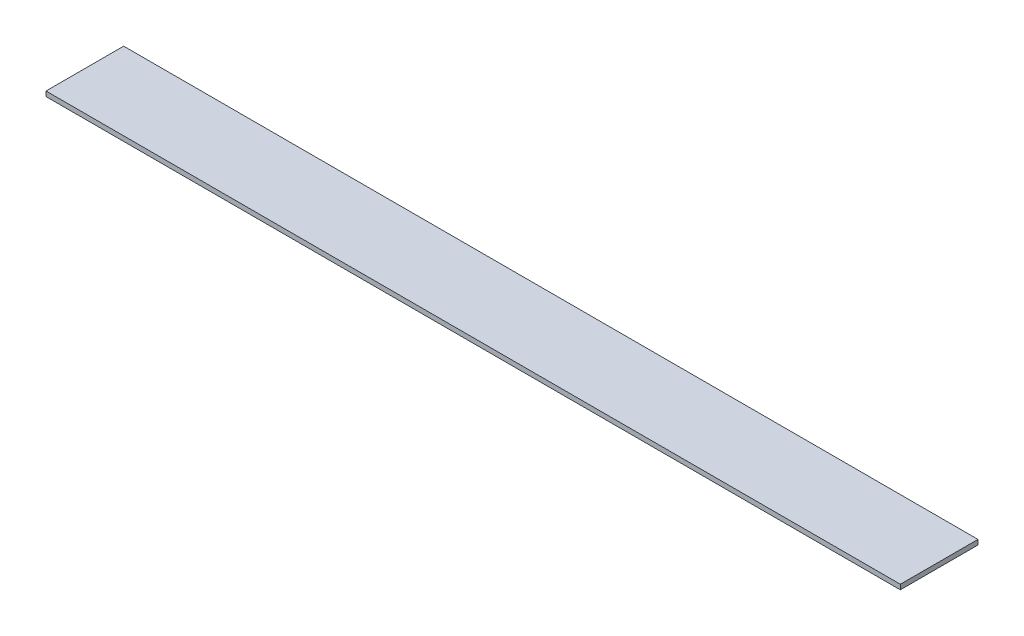
ISO-10303-21;
HEADER;
FILE_DESCRIPTION(('STEP AP214'),'2;1');
FILE_NAME('part.step','',(''),(''),'','','');
FILE_SCHEMA(('AUTOMOTIVE_DESIGN { 1 0 10303 214 1 1 1 1 }'));
ENDSEC;
DATA;
#1=APPLICATION_CONTEXT('core data for automotive mechanical design processes');
#2=APPLICATION_PROTOCOL_DEFINITION('international standard','automotive_design',2000,#1);
#3=PRODUCT_CONTEXT('',#1,'mechanical');
#4=PRODUCT('Part','Part','',(#3));
#5=PRODUCT_RELATED_PRODUCT_CATEGORY('part','',(#4));
#6=PRODUCT_DEFINITION_FORMATION('','',#4);
#7=PRODUCT_DEFINITION_CONTEXT('part definition',#1,'design');
#8=PRODUCT_DEFINITION('design','',#6,#7);
#9=PRODUCT_DEFINITION_SHAPE('','',#8);
#10=(LENGTH_UNIT() NAMED_UNIT(*) SI_UNIT(.MILLI.,.METRE.));
#11=(NAMED_UNIT(*) PLANE_ANGLE_UNIT() SI_UNIT($,.RADIAN.));
#12=(NAMED_UNIT(*) SI_UNIT($,.STERADIAN.) SOLID_ANGLE_UNIT());
#13=UNCERTAINTY_MEASURE_WITH_UNIT(LENGTH_MEASURE(1.E-05),#10,'distance_accuracy_value','');
#14=(GEOMETRIC_REPRESENTATION_CONTEXT(3) GLOBAL_UNCERTAINTY_ASSIGNED_CONTEXT((#13)) GLOBAL_UNIT_ASSIGNED_CONTEXT((#10,
#11,#12)) REPRESENTATION_CONTEXT('',''));
#15=CARTESIAN_POINT('',(0.,0.,0.));
#16=DIRECTION('',(0.,0.,1.));
#17=DIRECTION('',(1.,0.,0.));
#18=AXIS2_PLACEMENT_3D('',#15,#16,#17);
#19=CARTESIAN_POINT('',(139.7,0.79375,12.7));
#20=DIRECTION('',(-1.,0.,0.));
#21=DIRECTION('',(0.,0.,1.));
#22=AXIS2_PLACEMENT_3D('',#19,#20,#21);
#23=PLANE('',#22);
#24=DIRECTION('',(0.,0.,-1.));
#25=VECTOR('',#24,1.);
#26=CARTESIAN_POINT('',(139.7,-0.79375,12.7));
#27=LINE('',#26,#25);
#28=CARTESIAN_POINT('',(139.7,-0.79375,12.7));
#29=VERTEX_POINT('',#28);
#30=CARTESIAN_POINT('',(139.7,-0.79375,-12.7));
#31=VERTEX_POINT('',#30);
#32=EDGE_CURVE('E98',#29,#31,#27,.T.);
#33=ORIENTED_EDGE('',*,*,#32,.T.);
#34=DIRECTION('',(0.,-1.,0.));
#35=VECTOR('',#34,1.);
#36=CARTESIAN_POINT('',(139.7,0.79375,-12.7));
#37=LINE('',#36,#35);
#38=CARTESIAN_POINT('',(139.7,0.79375,-12.7));
#39=VERTEX_POINT('',#38);
#40=EDGE_CURVE('E11',#39,#31,#37,.T.);
#41=ORIENTED_EDGE('',*,*,#40,.F.);
#42=DIRECTION('',(0.,0.,-1.));
#43=VECTOR('',#42,1.);
#44=CARTESIAN_POINT('',(139.7,0.79375,12.7));
#45=LINE('',#44,#43);
#46=CARTESIAN_POINT('',(139.7,0.79375,12.7));
#47=VERTEX_POINT('',#46);
#48=EDGE_CURVE('E86',#47,#39,#45,.T.);
#49=ORIENTED_EDGE('',*,*,#48,.F.);
#50=DIRECTION('',(0.,-1.,0.));
#51=VECTOR('',#50,1.);
#52=CARTESIAN_POINT('',(139.7,0.79375,12.7));
#53=LINE('',#52,#51);
#54=EDGE_CURVE('E94',#47,#29,#53,.T.);
#55=ORIENTED_EDGE('',*,*,#54,.T.);
#56=EDGE_LOOP('',(#33,#41,#49,#55));
#57=FACE_BOUND('',#56,.T.);
#58=ADVANCED_FACE('F35',(#57),#23,.F.);
#59=CARTESIAN_POINT('',(-139.7,0.79375,-12.7));
#60=DIRECTION('',(0.,0.,1.));
#61=DIRECTION('',(1.,0.,0.));
#62=AXIS2_PLACEMENT_3D('',#59,#60,#61);
#63=PLANE('',#62);
#64=DIRECTION('',(-1.,0.,0.));
#65=VECTOR('',#64,1.);
#66=CARTESIAN_POINT('',(-139.7,-0.79375,-12.7));
#67=LINE('',#66,#65);
#68=CARTESIAN_POINT('',(-139.7,-0.79375,-12.7));
#69=VERTEX_POINT('',#68);
#70=EDGE_CURVE('E90',#31,#69,#67,.T.);
#71=ORIENTED_EDGE('',*,*,#70,.T.);
#72=DIRECTION('',(0.,-1.,0.));
#73=VECTOR('',#72,1.);
#74=CARTESIAN_POINT('',(-139.7,0.79375,-12.7));
#75=LINE('',#74,#73);
#76=CARTESIAN_POINT('',(-139.7,0.79375,-12.7));
#77=VERTEX_POINT('',#76);
#78=EDGE_CURVE('E43',#77,#69,#75,.T.);
#79=ORIENTED_EDGE('',*,*,#78,.F.);
#80=DIRECTION('',(-1.,0.,0.));
#81=VECTOR('',#80,1.);
#82=CARTESIAN_POINT('',(-139.7,0.79375,-12.7));
#83=LINE('',#82,#81);
#84=EDGE_CURVE('E81',#39,#77,#83,.T.);
#85=ORIENTED_EDGE('',*,*,#84,.F.);
#86=ORIENTED_EDGE('',*,*,#40,.T.);
#87=EDGE_LOOP('',(#71,#79,#85,#86));
#88=FACE_BOUND('',#87,.T.);
#89=ADVANCED_FACE('F89',(#88),#63,.F.);
#90=CARTESIAN_POINT('',(-139.7,0.79375,12.7));
#91=DIRECTION('',(1.,0.,0.));
#92=DIRECTION('',(0.,0.,-1.));
#93=AXIS2_PLACEMENT_3D('',#90,#91,#92);
#94=PLANE('',#93);
#95=DIRECTION('',(0.,0.,1.));
#96=VECTOR('',#95,1.);
#97=CARTESIAN_POINT('',(-139.7,-0.79375,12.7));
#98=LINE('',#97,#96);
#99=CARTESIAN_POINT('',(-139.7,-0.79375,12.7));
#100=VERTEX_POINT('',#99);
#101=EDGE_CURVE('E68',#69,#100,#98,.T.);
#102=ORIENTED_EDGE('',*,*,#101,.T.);
#103=DIRECTION('',(0.,-1.,0.));
#104=VECTOR('',#103,1.);
#105=CARTESIAN_POINT('',(-139.7,0.79375,12.7));
#106=LINE('',#105,#104);
#107=CARTESIAN_POINT('',(-139.7,0.79375,12.7));
#108=VERTEX_POINT('',#107);
#109=EDGE_CURVE('E91',#108,#100,#106,.T.);
#110=ORIENTED_EDGE('',*,*,#109,.F.);
#111=DIRECTION('',(0.,0.,1.));
#112=VECTOR('',#111,1.);
#113=CARTESIAN_POINT('',(-139.7,0.79375,12.7));
#114=LINE('',#113,#112);
#115=EDGE_CURVE('E84',#77,#108,#114,.T.);
#116=ORIENTED_EDGE('',*,*,#115,.F.);
#117=ORIENTED_EDGE('',*,*,#78,.T.);
#118=EDGE_LOOP('',(#102,#110,#116,#117));
#119=FACE_BOUND('',#118,.T.);
#120=ADVANCED_FACE('F92',(#119),#94,.F.);
#121=CARTESIAN_POINT('',(-139.7,0.79375,12.7));
#122=DIRECTION('',(0.,0.,-1.));
#123=DIRECTION('',(-1.,0.,0.));
#124=AXIS2_PLACEMENT_3D('',#121,#122,#123);
#125=PLANE('',#124);
#126=DIRECTION('',(1.,0.,0.));
#127=VECTOR('',#126,1.);
#128=CARTESIAN_POINT('',(-139.7,-0.79375,12.7));
#129=LINE('',#128,#127);
#130=EDGE_CURVE('E74',#100,#29,#129,.T.);
#131=ORIENTED_EDGE('',*,*,#130,.T.);
#132=ORIENTED_EDGE('',*,*,#54,.F.);
#133=DIRECTION('',(1.,0.,0.));
#134=VECTOR('',#133,1.);
#135=CARTESIAN_POINT('',(-139.7,0.79375,12.7));
#136=LINE('',#135,#134);
#137=EDGE_CURVE('E51',#108,#47,#136,.T.);
#138=ORIENTED_EDGE('',*,*,#137,.F.);
#139=ORIENTED_EDGE('',*,*,#109,.T.);
#140=EDGE_LOOP('',(#131,#132,#138,#139));
#141=FACE_BOUND('',#140,.T.);
#142=ADVANCED_FACE('F105',(#141),#125,.F.);
#143=CARTESIAN_POINT('',(0.,0.79375,0.));
#144=DIRECTION('',(0.,-1.,0.));
#145=DIRECTION('',(0.,0.,-1.));
#146=AXIS2_PLACEMENT_3D('',#143,#144,#145);
#147=PLANE('',#146);
#148=ORIENTED_EDGE('',*,*,#48,.T.);
#149=ORIENTED_EDGE('',*,*,#84,.T.);
#150=ORIENTED_EDGE('',*,*,#115,.T.);
#151=ORIENTED_EDGE('',*,*,#137,.T.);
#152=EDGE_LOOP('',(#148,#149,#150,#151));
#153=FACE_BOUND('',#152,.T.);
#154=ADVANCED_FACE('F82',(#153),#147,.F.);
#155=CARTESIAN_POINT('',(0.,-0.79375,0.));
#156=DIRECTION('',(0.,-1.,0.));
#157=DIRECTION('',(0.,0.,-1.));
#158=AXIS2_PLACEMENT_3D('',#155,#156,#157);
#159=PLANE('',#158);
#160=ORIENTED_EDGE('',*,*,#32,.F.);
#161=ORIENTED_EDGE('',*,*,#130,.F.);
#162=ORIENTED_EDGE('',*,*,#101,.F.);
#163=ORIENTED_EDGE('',*,*,#70,.F.);
#164=EDGE_LOOP('',(#160,#161,#162,#163));
#165=FACE_BOUND('',#164,.T.);
#166=ADVANCED_FACE('F108',(#165),#159,.T.);
#167=CLOSED_SHELL('',(#58,#89,#120,#142,#154,#166));
#168=MANIFOLD_SOLID_BREP('B2',#167);
#169=ADVANCED_BREP_SHAPE_REPRESENTATION('',(#18,#168),#14);
#170=SHAPE_DEFINITION_REPRESENTATION(#9,#169);
ENDSEC;
END-ISO-10303-21;
